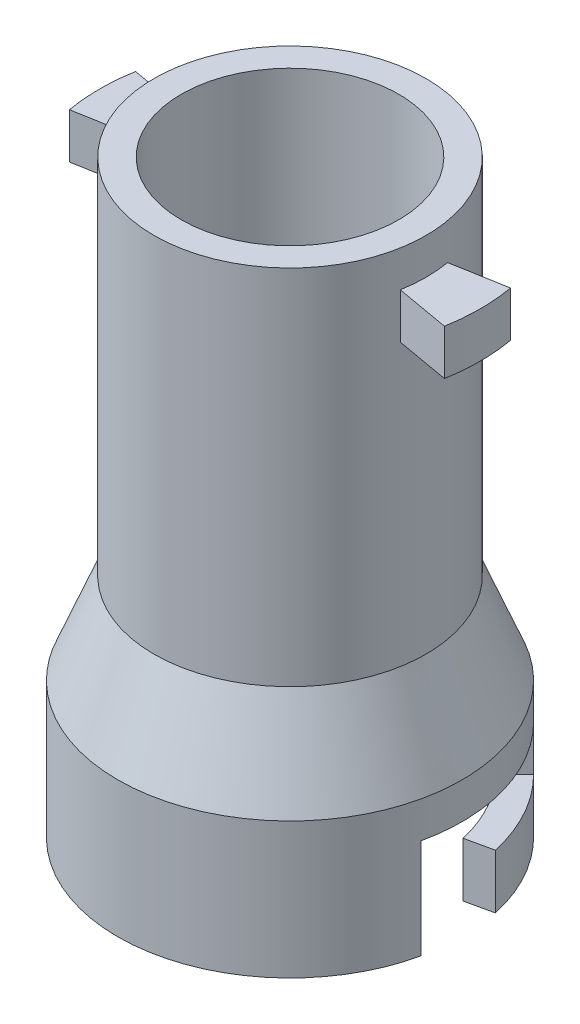
ISO-10303-21;
HEADER;
FILE_DESCRIPTION(('STEP AP214'),'2;1');
FILE_NAME('part.step','',(''),(''),'','','');
FILE_SCHEMA(('AUTOMOTIVE_DESIGN { 1 0 10303 214 1 1 1 1 }'));
ENDSEC;
DATA;
#1=APPLICATION_CONTEXT('core data for automotive mechanical design processes');
#2=APPLICATION_PROTOCOL_DEFINITION('international standard','automotive_design',2000,#1);
#3=PRODUCT_CONTEXT('',#1,'mechanical');
#4=PRODUCT('Part','Part','',(#3));
#5=PRODUCT_RELATED_PRODUCT_CATEGORY('part','',(#4));
#6=PRODUCT_DEFINITION_FORMATION('','',#4);
#7=PRODUCT_DEFINITION_CONTEXT('part definition',#1,'design');
#8=PRODUCT_DEFINITION('design','',#6,#7);
#9=PRODUCT_DEFINITION_SHAPE('','',#8);
#10=(LENGTH_UNIT() NAMED_UNIT(*) SI_UNIT(.MILLI.,.METRE.));
#11=(NAMED_UNIT(*) PLANE_ANGLE_UNIT() SI_UNIT($,.RADIAN.));
#12=(NAMED_UNIT(*) SI_UNIT($,.STERADIAN.) SOLID_ANGLE_UNIT());
#13=UNCERTAINTY_MEASURE_WITH_UNIT(LENGTH_MEASURE(1.E-05),#10,'distance_accuracy_value','');
#14=(GEOMETRIC_REPRESENTATION_CONTEXT(3) GLOBAL_UNCERTAINTY_ASSIGNED_CONTEXT((#13)) GLOBAL_UNIT_ASSIGNED_CONTEXT((#10,
#11,#12)) REPRESENTATION_CONTEXT('',''));
#15=CARTESIAN_POINT('',(0.,0.,0.));
#16=DIRECTION('',(0.,0.,1.));
#17=DIRECTION('',(1.,0.,0.));
#18=AXIS2_PLACEMENT_3D('',#15,#16,#17);
#19=CARTESIAN_POINT('',(0.,40.467735012162,0.));
#20=DIRECTION('',(0.,1.,0.));
#21=DIRECTION('',(0.,0.,1.));
#22=AXIS2_PLACEMENT_3D('',#19,#20,#21);
#23=CYLINDRICAL_SURFACE('',#22,16.);
#24=CARTESIAN_POINT('',(0.,-18.,0.));
#25=DIRECTION('',(0.,1.,0.));
#26=DIRECTION('',(0.,0.,1.));
#27=AXIS2_PLACEMENT_3D('',#24,#25,#26);
#28=CIRCLE('',#27,16.);
#29=CARTESIAN_POINT('',(0.,-18.,16.));
#30=VERTEX_POINT('',#29);
#31=EDGE_CURVE('E338',#30,#30,#28,.T.);
#32=ORIENTED_EDGE('',*,*,#31,.T.);
#33=EDGE_LOOP('',(#32));
#34=FACE_BOUND('',#33,.T.);
#35=DIRECTION('',(0.,1.,0.));
#36=VECTOR('',#35,1.);
#37=CARTESIAN_POINT('',(-11.3137084989848,-27.,11.3137084989848));
#38=LINE('',#37,#36);
#39=CARTESIAN_POINT('',(-11.3137084989848,-27.,11.3137084989848));
#40=VERTEX_POINT('',#39);
#41=CARTESIAN_POINT('',(-11.3137084989848,-23.,11.3137084989848));
#42=VERTEX_POINT('',#41);
#43=EDGE_CURVE('E190',#40,#42,#38,.T.);
#44=ORIENTED_EDGE('',*,*,#43,.T.);
#45=CARTESIAN_POINT('',(0.,-23.,0.));
#46=DIRECTION('',(0.,1.,0.));
#47=DIRECTION('',(0.,0.,1.));
#48=AXIS2_PLACEMENT_3D('',#45,#46,#47);
#49=CIRCLE('',#48,16.);
#50=CARTESIAN_POINT('',(-15.6207361139189,-23.,-3.46303382300966));
#51=VERTEX_POINT('',#50);
#52=EDGE_CURVE('E174',#51,#42,#49,.T.);
#53=ORIENTED_EDGE('',*,*,#52,.F.);
#54=DIRECTION('',(0.,1.,0.));
#55=VECTOR('',#54,1.);
#56=CARTESIAN_POINT('',(-15.6207361139189,-23.,-3.46303382300966));
#57=LINE('',#56,#55);
#58=CARTESIAN_POINT('',(-15.6207361139189,-33.,-3.46303382300966));
#59=VERTEX_POINT('',#58);
#60=EDGE_CURVE('E253',#59,#51,#57,.T.);
#61=ORIENTED_EDGE('',*,*,#60,.F.);
#62=CARTESIAN_POINT('',(0.,-33.,0.));
#63=DIRECTION('',(0.,1.,0.));
#64=DIRECTION('',(0.,0.,1.));
#65=AXIS2_PLACEMENT_3D('',#62,#63,#64);
#66=CIRCLE('',#65,16.);
#67=CARTESIAN_POINT('',(15.6207361139189,-33.,-3.46303382300966));
#68=VERTEX_POINT('',#67);
#69=EDGE_CURVE('E334',#68,#59,#66,.T.);
#70=ORIENTED_EDGE('',*,*,#69,.F.);
#71=DIRECTION('',(0.,-1.,0.));
#72=VECTOR('',#71,1.);
#73=CARTESIAN_POINT('',(15.6207361139189,-33.,-3.46303382300966));
#74=LINE('',#73,#72);
#75=CARTESIAN_POINT('',(15.6207361139189,-27.,-3.46303382300966));
#76=VERTEX_POINT('',#75);
#77=EDGE_CURVE('E222',#76,#68,#74,.T.);
#78=ORIENTED_EDGE('',*,*,#77,.F.);
#79=CARTESIAN_POINT('',(0.,-27.,0.));
#80=DIRECTION('',(0.,-1.,0.));
#81=DIRECTION('',(0.,0.,-1.));
#82=AXIS2_PLACEMENT_3D('',#79,#80,#81);
#83=CIRCLE('',#82,16.);
#84=CARTESIAN_POINT('',(11.3137084989848,-27.,-11.3137084989848));
#85=VERTEX_POINT('',#84);
#86=EDGE_CURVE('E215',#85,#76,#83,.T.);
#87=ORIENTED_EDGE('',*,*,#86,.F.);
#88=DIRECTION('',(0.,-1.,0.));
#89=VECTOR('',#88,1.);
#90=CARTESIAN_POINT('',(11.3137084989848,-22.,-11.3137084989848));
#91=LINE('',#90,#89);
#92=CARTESIAN_POINT('',(11.3137084989848,-22.,-11.3137084989848));
#93=VERTEX_POINT('',#92);
#94=EDGE_CURVE('E210',#93,#85,#91,.T.);
#95=ORIENTED_EDGE('',*,*,#94,.F.);
#96=CARTESIAN_POINT('',(0.,-22.,0.));
#97=DIRECTION('',(0.,1.,0.));
#98=DIRECTION('',(0.,0.,1.));
#99=AXIS2_PLACEMENT_3D('',#96,#97,#98);
#100=CIRCLE('',#99,16.);
#101=CARTESIAN_POINT('',(15.6207361139189,-22.,3.46303382300966));
#102=VERTEX_POINT('',#101);
#103=EDGE_CURVE('E236',#102,#93,#100,.T.);
#104=ORIENTED_EDGE('',*,*,#103,.F.);
#105=DIRECTION('',(0.,-1.,0.));
#106=VECTOR('',#105,1.);
#107=CARTESIAN_POINT('',(15.6207361139189,-33.,3.46303382300966));
#108=LINE('',#107,#106);
#109=CARTESIAN_POINT('',(15.6207361139189,-33.,3.46303382300966));
#110=VERTEX_POINT('',#109);
#111=EDGE_CURVE('E230',#102,#110,#108,.T.);
#112=ORIENTED_EDGE('',*,*,#111,.T.);
#113=CARTESIAN_POINT('',(-15.6207361139189,-33.,3.46303382300966));
#114=VERTEX_POINT('',#113);
#115=EDGE_CURVE('E335',#114,#110,#66,.T.);
#116=ORIENTED_EDGE('',*,*,#115,.F.);
#117=DIRECTION('',(0.,1.,0.));
#118=VECTOR('',#117,1.);
#119=CARTESIAN_POINT('',(-15.6207361139189,-23.,3.46303382300966));
#120=LINE('',#119,#118);
#121=CARTESIAN_POINT('',(-15.6207361139189,-27.,3.46303382300966));
#122=VERTEX_POINT('',#121);
#123=EDGE_CURVE('E245',#114,#122,#120,.T.);
#124=ORIENTED_EDGE('',*,*,#123,.T.);
#125=CARTESIAN_POINT('',(0.,-27.,0.));
#126=DIRECTION('',(0.,-1.,0.));
#127=DIRECTION('',(0.,0.,-1.));
#128=AXIS2_PLACEMENT_3D('',#125,#126,#127);
#129=CIRCLE('',#128,16.);
#130=EDGE_CURVE('E49',#40,#122,#129,.T.);
#131=ORIENTED_EDGE('',*,*,#130,.F.);
#132=EDGE_LOOP('',(#44,#53,#61,#70,#78,#87,#95,#104,#112,#116,#124,#131));
#133=FACE_BOUND('',#132,.T.);
#134=ADVANCED_FACE('F35',(#34,#133),#23,.F.);
#135=CARTESIAN_POINT('',(0.,40.467735012162,0.));
#136=DIRECTION('',(0.,1.,0.));
#137=DIRECTION('',(0.,0.,1.));
#138=AXIS2_PLACEMENT_3D('',#135,#136,#137);
#139=CYLINDRICAL_SURFACE('',#138,19.);
#140=CARTESIAN_POINT('',(0.,-18.,0.));
#141=DIRECTION('',(0.,1.,0.));
#142=DIRECTION('',(0.,0.,1.));
#143=AXIS2_PLACEMENT_3D('',#140,#141,#142);
#144=CIRCLE('',#143,19.);
#145=CARTESIAN_POINT('',(0.,-18.,19.));
#146=VERTEX_POINT('',#145);
#147=EDGE_CURVE('E327',#146,#146,#144,.T.);
#148=ORIENTED_EDGE('',*,*,#147,.F.);
#149=EDGE_LOOP('',(#148));
#150=FACE_BOUND('',#149,.T.);
#151=CARTESIAN_POINT('',(0.,-23.,0.));
#152=DIRECTION('',(0.,1.,0.));
#153=DIRECTION('',(0.,0.,1.));
#154=AXIS2_PLACEMENT_3D('',#151,#152,#153);
#155=CIRCLE('',#154,19.);
#156=CARTESIAN_POINT('',(-18.5496241352787,-23.,-4.11235266482396));
#157=VERTEX_POINT('',#156);
#158=CARTESIAN_POINT('',(-13.4350288425444,-23.,13.4350288425444));
#159=VERTEX_POINT('',#158);
#160=EDGE_CURVE('E185',#157,#159,#155,.T.);
#161=ORIENTED_EDGE('',*,*,#160,.T.);
#162=DIRECTION('',(0.,-1.,0.));
#163=VECTOR('',#162,1.);
#164=CARTESIAN_POINT('',(-13.4350288425444,-27.,13.4350288425444));
#165=LINE('',#164,#163);
#166=CARTESIAN_POINT('',(-13.4350288425444,-27.,13.4350288425444));
#167=VERTEX_POINT('',#166);
#168=EDGE_CURVE('E192',#159,#167,#165,.T.);
#169=ORIENTED_EDGE('',*,*,#168,.T.);
#170=CARTESIAN_POINT('',(0.,-27.,0.));
#171=DIRECTION('',(0.,-1.,0.));
#172=DIRECTION('',(0.,0.,-1.));
#173=AXIS2_PLACEMENT_3D('',#170,#171,#172);
#174=CIRCLE('',#173,19.);
#175=CARTESIAN_POINT('',(-18.5496241352787,-27.,4.11235266482397));
#176=VERTEX_POINT('',#175);
#177=EDGE_CURVE('E201',#167,#176,#174,.T.);
#178=ORIENTED_EDGE('',*,*,#177,.T.);
#179=DIRECTION('',(0.,-1.,0.));
#180=VECTOR('',#179,1.);
#181=CARTESIAN_POINT('',(-18.5496241352787,-23.,4.11235266482396));
#182=LINE('',#181,#180);
#183=CARTESIAN_POINT('',(-18.5496241352787,-33.,4.11235266482397));
#184=VERTEX_POINT('',#183);
#185=EDGE_CURVE('E240',#176,#184,#182,.T.);
#186=ORIENTED_EDGE('',*,*,#185,.T.);
#187=CARTESIAN_POINT('',(0.,-33.,0.));
#188=DIRECTION('',(0.,1.,0.));
#189=DIRECTION('',(0.,0.,1.));
#190=AXIS2_PLACEMENT_3D('',#187,#188,#189);
#191=CIRCLE('',#190,19.);
#192=CARTESIAN_POINT('',(18.5496241352787,-33.,4.11235266482396));
#193=VERTEX_POINT('',#192);
#194=EDGE_CURVE('E331',#184,#193,#191,.T.);
#195=ORIENTED_EDGE('',*,*,#194,.T.);
#196=DIRECTION('',(0.,1.,0.));
#197=VECTOR('',#196,1.);
#198=CARTESIAN_POINT('',(18.5496241352787,-33.,4.11235266482396));
#199=LINE('',#198,#197);
#200=CARTESIAN_POINT('',(18.5496241352787,-22.,4.11235266482396));
#201=VERTEX_POINT('',#200);
#202=EDGE_CURVE('E225',#193,#201,#199,.T.);
#203=ORIENTED_EDGE('',*,*,#202,.T.);
#204=CARTESIAN_POINT('',(0.,-22.,0.));
#205=DIRECTION('',(0.,1.,0.));
#206=DIRECTION('',(0.,0.,1.));
#207=AXIS2_PLACEMENT_3D('',#204,#205,#206);
#208=CIRCLE('',#207,19.);
#209=CARTESIAN_POINT('',(13.4350288425444,-22.,-13.4350288425444));
#210=VERTEX_POINT('',#209);
#211=EDGE_CURVE('E238',#201,#210,#208,.T.);
#212=ORIENTED_EDGE('',*,*,#211,.T.);
#213=DIRECTION('',(0.,1.,0.));
#214=VECTOR('',#213,1.);
#215=CARTESIAN_POINT('',(13.4350288425444,-22.,-13.4350288425444));
#216=LINE('',#215,#214);
#217=CARTESIAN_POINT('',(13.4350288425444,-27.,-13.4350288425444));
#218=VERTEX_POINT('',#217);
#219=EDGE_CURVE('E204',#218,#210,#216,.T.);
#220=ORIENTED_EDGE('',*,*,#219,.F.);
#221=CARTESIAN_POINT('',(0.,-27.,0.));
#222=DIRECTION('',(0.,-1.,0.));
#223=DIRECTION('',(0.,0.,-1.));
#224=AXIS2_PLACEMENT_3D('',#221,#222,#223);
#225=CIRCLE('',#224,19.);
#226=CARTESIAN_POINT('',(18.5496241352787,-27.,-4.11235266482397));
#227=VERTEX_POINT('',#226);
#228=EDGE_CURVE('E217',#218,#227,#225,.T.);
#229=ORIENTED_EDGE('',*,*,#228,.T.);
#230=DIRECTION('',(0.,1.,0.));
#231=VECTOR('',#230,1.);
#232=CARTESIAN_POINT('',(18.5496241352787,-33.,-4.11235266482397));
#233=LINE('',#232,#231);
#234=CARTESIAN_POINT('',(18.5496241352787,-33.,-4.11235266482397));
#235=VERTEX_POINT('',#234);
#236=EDGE_CURVE('E220',#235,#227,#233,.T.);
#237=ORIENTED_EDGE('',*,*,#236,.F.);
#238=CARTESIAN_POINT('',(-18.5496241352787,-33.,-4.11235266482396));
#239=VERTEX_POINT('',#238);
#240=EDGE_CURVE('E330',#235,#239,#191,.T.);
#241=ORIENTED_EDGE('',*,*,#240,.T.);
#242=DIRECTION('',(0.,-1.,0.));
#243=VECTOR('',#242,1.);
#244=CARTESIAN_POINT('',(-18.5496241352787,-23.,-4.11235266482396));
#245=LINE('',#244,#243);
#246=EDGE_CURVE('E247',#157,#239,#245,.T.);
#247=ORIENTED_EDGE('',*,*,#246,.F.);
#248=EDGE_LOOP('',(#161,#169,#178,#186,#195,#203,#212,#220,#229,#237,#241,#247));
#249=FACE_BOUND('',#248,.T.);
#250=ADVANCED_FACE('F354',(#150,#249),#139,.T.);
#251=CARTESIAN_POINT('',(-18.5496241352787,-33.,4.11235266482397));
#252=DIRECTION('',(0.216439613938103,0.,0.976296007119933));
#253=DIRECTION('',(0.976296007119933,0.,-0.216439613938103));
#254=AXIS2_PLACEMENT_3D('',#251,#252,#253);
#255=PLANE('',#254);
#256=DIRECTION('',(-0.976296007119933,0.,0.216439613938103));
#257=VECTOR('',#256,1.);
#258=CARTESIAN_POINT('',(-18.5496241352787,-27.,4.11235266482397));
#259=LINE('',#258,#257);
#260=EDGE_CURVE('E11',#122,#176,#259,.T.);
#261=ORIENTED_EDGE('',*,*,#260,.F.);
#262=ORIENTED_EDGE('',*,*,#123,.F.);
#263=DIRECTION('',(0.976296007119933,0.,-0.216439613938103));
#264=VECTOR('',#263,1.);
#265=CARTESIAN_POINT('',(-18.5496241352787,-33.,4.11235266482397));
#266=LINE('',#265,#264);
#267=EDGE_CURVE('E242',#184,#114,#266,.T.);
#268=ORIENTED_EDGE('',*,*,#267,.F.);
#269=ORIENTED_EDGE('',*,*,#185,.F.);
#270=EDGE_LOOP('',(#261,#262,#268,#269));
#271=FACE_BOUND('',#270,.T.);
#272=ADVANCED_FACE('F375',(#271),#255,.F.);
#273=CARTESIAN_POINT('',(16.,-33.,0.));
#274=DIRECTION('',(0.,1.,0.));
#275=DIRECTION('',(0.,0.,1.));
#276=AXIS2_PLACEMENT_3D('',#273,#274,#275);
#277=PLANE('',#276);
#278=DIRECTION('',(0.976296007119933,0.,-0.216439613938103));
#279=VECTOR('',#278,1.);
#280=CARTESIAN_POINT('',(18.5496241352787,-33.,-4.11235266482397));
#281=LINE('',#280,#279);
#282=EDGE_CURVE('E57',#68,#235,#281,.T.);
#283=ORIENTED_EDGE('',*,*,#282,.F.);
#284=ORIENTED_EDGE('',*,*,#69,.T.);
#285=DIRECTION('',(0.976296007119933,0.,0.216439613938103));
#286=VECTOR('',#285,1.);
#287=CARTESIAN_POINT('',(-18.5496241352787,-33.,-4.11235266482396));
#288=LINE('',#287,#286);
#289=EDGE_CURVE('E250',#239,#59,#288,.T.);
#290=ORIENTED_EDGE('',*,*,#289,.F.);
#291=ORIENTED_EDGE('',*,*,#240,.F.);
#292=EDGE_LOOP('',(#283,#284,#290,#291));
#293=FACE_BOUND('',#292,.T.);
#294=ADVANCED_FACE('F529',(#293),#277,.F.);
#295=ORIENTED_EDGE('',*,*,#115,.T.);
#296=DIRECTION('',(0.976296007119933,0.,0.216439613938103));
#297=VECTOR('',#296,1.);
#298=CARTESIAN_POINT('',(18.5496241352787,-33.,4.11235266482396));
#299=LINE('',#298,#297);
#300=EDGE_CURVE('E233',#110,#193,#299,.T.);
#301=ORIENTED_EDGE('',*,*,#300,.T.);
#302=ORIENTED_EDGE('',*,*,#194,.F.);
#303=ORIENTED_EDGE('',*,*,#267,.T.);
#304=EDGE_LOOP('',(#295,#301,#302,#303));
#305=FACE_BOUND('',#304,.T.);
#306=ADVANCED_FACE('F380',(#305),#277,.F.);
#307=CARTESIAN_POINT('',(0.,40.467735012162,0.));
#308=DIRECTION('',(0.,1.,0.));
#309=DIRECTION('',(0.,0.,1.));
#310=AXIS2_PLACEMENT_3D('',#307,#308,#309);
#311=CYLINDRICAL_SURFACE('',#310,15.);
#312=CARTESIAN_POINT('',(0.,23.,0.));
#313=DIRECTION('',(0.,1.,0.));
#314=DIRECTION('',(0.,0.,1.));
#315=AXIS2_PLACEMENT_3D('',#312,#313,#314);
#316=CIRCLE('',#315,15.);
#317=CARTESIAN_POINT('',(-14.7721162951831,23.,-2.60472266500396));
#318=VERTEX_POINT('',#317);
#319=CARTESIAN_POINT('',(-14.7721162951831,23.,2.60472266500396));
#320=VERTEX_POINT('',#319);
#321=EDGE_CURVE('E283',#318,#320,#316,.T.);
#322=ORIENTED_EDGE('',*,*,#321,.F.);
#323=DIRECTION('',(0.,1.,0.));
#324=VECTOR('',#323,1.);
#325=CARTESIAN_POINT('',(-14.7721162951831,28.,-2.60472266500396));
#326=LINE('',#325,#324);
#327=CARTESIAN_POINT('',(-14.7721162951831,28.,-2.60472266500396));
#328=VERTEX_POINT('',#327);
#329=EDGE_CURVE('E277',#318,#328,#326,.T.);
#330=ORIENTED_EDGE('',*,*,#329,.T.);
#331=CARTESIAN_POINT('',(0.,28.,0.));
#332=DIRECTION('',(0.,1.,0.));
#333=DIRECTION('',(0.,0.,1.));
#334=AXIS2_PLACEMENT_3D('',#331,#332,#333);
#335=CIRCLE('',#334,15.);
#336=CARTESIAN_POINT('',(-14.7721162951831,28.,2.60472266500396));
#337=VERTEX_POINT('',#336);
#338=EDGE_CURVE('E286',#328,#337,#335,.T.);
#339=ORIENTED_EDGE('',*,*,#338,.T.);
#340=DIRECTION('',(0.,1.,0.));
#341=VECTOR('',#340,1.);
#342=CARTESIAN_POINT('',(-14.7721162951831,28.,2.60472266500396));
#343=LINE('',#342,#341);
#344=EDGE_CURVE('E265',#320,#337,#343,.T.);
#345=ORIENTED_EDGE('',*,*,#344,.F.);
#346=EDGE_LOOP('',(#322,#330,#339,#345));
#347=FACE_BOUND('',#346,.T.);
#348=CARTESIAN_POINT('',(0.,-8.,0.));
#349=DIRECTION('',(0.,1.,0.));
#350=DIRECTION('',(0.,0.,1.));
#351=AXIS2_PLACEMENT_3D('',#348,#349,#350);
#352=CIRCLE('',#351,15.);
#353=CARTESIAN_POINT('',(0.,-8.,15.));
#354=VERTEX_POINT('',#353);
#355=EDGE_CURVE('E324',#354,#354,#352,.T.);
#356=ORIENTED_EDGE('',*,*,#355,.T.);
#357=EDGE_LOOP('',(#356));
#358=FACE_BOUND('',#357,.T.);
#359=CARTESIAN_POINT('',(0.,32.,0.));
#360=DIRECTION('',(0.,1.,0.));
#361=DIRECTION('',(0.,0.,1.));
#362=AXIS2_PLACEMENT_3D('',#359,#360,#361);
#363=CIRCLE('',#362,15.);
#364=CARTESIAN_POINT('',(0.,32.,15.));
#365=VERTEX_POINT('',#364);
#366=EDGE_CURVE('E321',#365,#365,#363,.T.);
#367=ORIENTED_EDGE('',*,*,#366,.F.);
#368=EDGE_LOOP('',(#367));
#369=FACE_BOUND('',#368,.T.);
#370=DIRECTION('',(0.,-1.,0.));
#371=VECTOR('',#370,1.);
#372=CARTESIAN_POINT('',(14.7721162951831,23.,2.60472266500396));
#373=LINE('',#372,#371);
#374=CARTESIAN_POINT('',(14.7721162951831,28.,2.60472266500396));
#375=VERTEX_POINT('',#374);
#376=CARTESIAN_POINT('',(14.7721162951831,23.,2.60472266500396));
#377=VERTEX_POINT('',#376);
#378=EDGE_CURVE('E299',#375,#377,#373,.T.);
#379=ORIENTED_EDGE('',*,*,#378,.F.);
#380=CARTESIAN_POINT('',(0.,28.,0.));
#381=DIRECTION('',(0.,1.,0.));
#382=DIRECTION('',(0.,0.,1.));
#383=AXIS2_PLACEMENT_3D('',#380,#381,#382);
#384=CIRCLE('',#383,15.);
#385=CARTESIAN_POINT('',(14.7721162951831,28.,-2.60472266500396));
#386=VERTEX_POINT('',#385);
#387=EDGE_CURVE('E318',#375,#386,#384,.T.);
#388=ORIENTED_EDGE('',*,*,#387,.T.);
#389=DIRECTION('',(0.,-1.,0.));
#390=VECTOR('',#389,1.);
#391=CARTESIAN_POINT('',(14.7721162951831,23.,-2.60472266500396));
#392=LINE('',#391,#390);
#393=CARTESIAN_POINT('',(14.7721162951831,23.,-2.60472266500396));
#394=VERTEX_POINT('',#393);
#395=EDGE_CURVE('E288',#386,#394,#392,.T.);
#396=ORIENTED_EDGE('',*,*,#395,.T.);
#397=CARTESIAN_POINT('',(0.,23.,0.));
#398=DIRECTION('',(0.,1.,0.));
#399=DIRECTION('',(0.,0.,1.));
#400=AXIS2_PLACEMENT_3D('',#397,#398,#399);
#401=CIRCLE('',#400,15.);
#402=EDGE_CURVE('E311',#377,#394,#401,.T.);
#403=ORIENTED_EDGE('',*,*,#402,.F.);
#404=EDGE_LOOP('',(#379,#388,#396,#403));
#405=FACE_BOUND('',#404,.T.);
#406=ADVANCED_FACE('F391',(#347,#358,#369,#405),#311,.T.);
#407=CARTESIAN_POINT('',(15.,32.,0.));
#408=DIRECTION('',(0.,-1.,0.));
#409=DIRECTION('',(0.,0.,-1.));
#410=AXIS2_PLACEMENT_3D('',#407,#408,#409);
#411=PLANE('',#410);
#412=CARTESIAN_POINT('',(0.,32.,0.));
#413=DIRECTION('',(0.,1.,0.));
#414=DIRECTION('',(0.,0.,1.));
#415=AXIS2_PLACEMENT_3D('',#412,#413,#414);
#416=CIRCLE('',#415,12.);
#417=CARTESIAN_POINT('',(0.,32.,12.));
#418=VERTEX_POINT('',#417);
#419=EDGE_CURVE('E344',#418,#418,#416,.T.);
#420=ORIENTED_EDGE('',*,*,#419,.F.);
#421=EDGE_LOOP('',(#420));
#422=FACE_BOUND('',#421,.T.);
#423=ORIENTED_EDGE('',*,*,#366,.T.);
#424=EDGE_LOOP('',(#423));
#425=FACE_BOUND('',#424,.T.);
#426=ADVANCED_FACE('F37',(#422,#425),#411,.F.);
#427=CARTESIAN_POINT('',(0.,40.467735012162,0.));
#428=DIRECTION('',(0.,1.,0.));
#429=DIRECTION('',(0.,0.,1.));
#430=AXIS2_PLACEMENT_3D('',#427,#428,#429);
#431=CYLINDRICAL_SURFACE('',#430,12.);
#432=CARTESIAN_POINT('',(0.,-18.,0.));
#433=DIRECTION('',(0.,1.,0.));
#434=DIRECTION('',(0.,0.,1.));
#435=AXIS2_PLACEMENT_3D('',#432,#433,#434);
#436=CIRCLE('',#435,12.);
#437=CARTESIAN_POINT('',(0.,-18.,12.));
#438=VERTEX_POINT('',#437);
#439=EDGE_CURVE('E341',#438,#438,#436,.T.);
#440=ORIENTED_EDGE('',*,*,#439,.F.);
#441=EDGE_LOOP('',(#440));
#442=FACE_BOUND('',#441,.T.);
#443=ORIENTED_EDGE('',*,*,#419,.T.);
#444=EDGE_LOOP('',(#443));
#445=FACE_BOUND('',#444,.T.);
#446=ADVANCED_FACE('F384',(#442,#445),#431,.F.);
#447=CARTESIAN_POINT('',(12.,-18.,0.));
#448=DIRECTION('',(0.,1.,0.));
#449=DIRECTION('',(0.,0.,1.));
#450=AXIS2_PLACEMENT_3D('',#447,#448,#449);
#451=PLANE('',#450);
#452=ORIENTED_EDGE('',*,*,#31,.F.);
#453=EDGE_LOOP('',(#452));
#454=FACE_BOUND('',#453,.T.);
#455=ORIENTED_EDGE('',*,*,#439,.T.);
#456=EDGE_LOOP('',(#455));
#457=FACE_BOUND('',#456,.T.);
#458=ADVANCED_FACE('F381',(#454,#457),#451,.F.);
#459=CARTESIAN_POINT('',(0.,-18.,0.));
#460=DIRECTION('',(0.,-1.,0.));
#461=DIRECTION('',(0.,0.,-1.));
#462=AXIS2_PLACEMENT_3D('',#459,#460,#461);
#463=CONICAL_SURFACE('',#462,19.,0.380506377112366);
#464=ORIENTED_EDGE('',*,*,#355,.F.);
#465=EDGE_LOOP('',(#464));
#466=FACE_BOUND('',#465,.T.);
#467=ORIENTED_EDGE('',*,*,#147,.T.);
#468=EDGE_LOOP('',(#467));
#469=FACE_BOUND('',#468,.T.);
#470=ADVANCED_FACE('F383',(#466,#469),#463,.T.);
#471=CARTESIAN_POINT('',(14.7721162951831,28.,2.60472266500396));
#472=DIRECTION('',(0.,-1.,0.));
#473=DIRECTION('',(0.,0.,-1.));
#474=AXIS2_PLACEMENT_3D('',#471,#472,#473);
#475=PLANE('',#474);
#476=CARTESIAN_POINT('',(0.,28.,0.));
#477=DIRECTION('',(0.,1.,0.));
#478=DIRECTION('',(0.,0.,1.));
#479=AXIS2_PLACEMENT_3D('',#476,#477,#478);
#480=CIRCLE('',#479,21.);
#481=CARTESIAN_POINT('',(20.6809628132564,28.,3.64661173100555));
#482=VERTEX_POINT('',#481);
#483=CARTESIAN_POINT('',(20.6809628132564,28.,-3.64661173100555));
#484=VERTEX_POINT('',#483);
#485=EDGE_CURVE('E316',#482,#484,#480,.T.);
#486=ORIENTED_EDGE('',*,*,#485,.T.);
#487=DIRECTION('',(-0.984807753012208,0.,0.173648177666931));
#488=VECTOR('',#487,1.);
#489=CARTESIAN_POINT('',(14.7721162951831,28.,-2.60472266500396));
#490=LINE('',#489,#488);
#491=EDGE_CURVE('E297',#484,#386,#490,.T.);
#492=ORIENTED_EDGE('',*,*,#491,.T.);
#493=ORIENTED_EDGE('',*,*,#387,.F.);
#494=DIRECTION('',(-0.984807753012208,0.,-0.173648177666931));
#495=VECTOR('',#494,1.);
#496=CARTESIAN_POINT('',(14.7721162951831,28.,2.60472266500396));
#497=LINE('',#496,#495);
#498=EDGE_CURVE('E308',#482,#375,#497,.T.);
#499=ORIENTED_EDGE('',*,*,#498,.F.);
#500=EDGE_LOOP('',(#486,#492,#493,#499));
#501=FACE_BOUND('',#500,.T.);
#502=ADVANCED_FACE('F410',(#501),#475,.F.);
#503=CARTESIAN_POINT('',(0.,45.3066617431812,0.));
#504=DIRECTION('',(0.,1.,0.));
#505=DIRECTION('',(0.,0.,1.));
#506=AXIS2_PLACEMENT_3D('',#503,#504,#505);
#507=CYLINDRICAL_SURFACE('',#506,21.);
#508=CARTESIAN_POINT('',(0.,23.,0.));
#509=DIRECTION('',(0.,1.,0.));
#510=DIRECTION('',(0.,0.,1.));
#511=AXIS2_PLACEMENT_3D('',#508,#509,#510);
#512=CIRCLE('',#511,21.);
#513=CARTESIAN_POINT('',(20.6809628132564,23.,3.64661173100555));
#514=VERTEX_POINT('',#513);
#515=CARTESIAN_POINT('',(20.6809628132564,23.,-3.64661173100555));
#516=VERTEX_POINT('',#515);
#517=EDGE_CURVE('E314',#514,#516,#512,.T.);
#518=ORIENTED_EDGE('',*,*,#517,.T.);
#519=DIRECTION('',(0.,1.,0.));
#520=VECTOR('',#519,1.);
#521=CARTESIAN_POINT('',(20.6809628132564,28.,-3.64661173100555));
#522=LINE('',#521,#520);
#523=EDGE_CURVE('E294',#516,#484,#522,.T.);
#524=ORIENTED_EDGE('',*,*,#523,.T.);
#525=ORIENTED_EDGE('',*,*,#485,.F.);
#526=DIRECTION('',(0.,1.,0.));
#527=VECTOR('',#526,1.);
#528=CARTESIAN_POINT('',(20.6809628132564,28.,3.64661173100555));
#529=LINE('',#528,#527);
#530=EDGE_CURVE('E305',#514,#482,#529,.T.);
#531=ORIENTED_EDGE('',*,*,#530,.F.);
#532=EDGE_LOOP('',(#518,#524,#525,#531));
#533=FACE_BOUND('',#532,.T.);
#534=ADVANCED_FACE('F419',(#533),#507,.T.);
#535=CARTESIAN_POINT('',(20.6809628132564,23.,3.64661173100555));
#536=DIRECTION('',(0.,1.,0.));
#537=DIRECTION('',(0.,0.,1.));
#538=AXIS2_PLACEMENT_3D('',#535,#536,#537);
#539=PLANE('',#538);
#540=DIRECTION('',(0.984807753012208,0.,0.173648177666931));
#541=VECTOR('',#540,1.);
#542=CARTESIAN_POINT('',(20.6809628132564,23.,3.64661173100555));
#543=LINE('',#542,#541);
#544=EDGE_CURVE('E302',#377,#514,#543,.T.);
#545=ORIENTED_EDGE('',*,*,#544,.F.);
#546=ORIENTED_EDGE('',*,*,#402,.T.);
#547=DIRECTION('',(0.984807753012208,0.,-0.173648177666931));
#548=VECTOR('',#547,1.);
#549=CARTESIAN_POINT('',(20.6809628132564,23.,-3.64661173100555));
#550=LINE('',#549,#548);
#551=EDGE_CURVE('E291',#394,#516,#550,.T.);
#552=ORIENTED_EDGE('',*,*,#551,.T.);
#553=ORIENTED_EDGE('',*,*,#517,.F.);
#554=EDGE_LOOP('',(#545,#546,#552,#553));
#555=FACE_BOUND('',#554,.T.);
#556=ADVANCED_FACE('F417',(#555),#539,.F.);
#557=CARTESIAN_POINT('',(14.7721162951831,28.,2.60472266500396));
#558=DIRECTION('',(0.173648177666931,0.,-0.984807753012208));
#559=DIRECTION('',(-0.984807753012208,0.,-0.173648177666931));
#560=AXIS2_PLACEMENT_3D('',#557,#558,#559);
#561=PLANE('',#560);
#562=ORIENTED_EDGE('',*,*,#378,.T.);
#563=ORIENTED_EDGE('',*,*,#544,.T.);
#564=ORIENTED_EDGE('',*,*,#530,.T.);
#565=ORIENTED_EDGE('',*,*,#498,.T.);
#566=EDGE_LOOP('',(#562,#563,#564,#565));
#567=FACE_BOUND('',#566,.T.);
#568=ADVANCED_FACE('F406',(#567),#561,.F.);
#569=CARTESIAN_POINT('',(14.7721162951831,28.,-2.60472266500396));
#570=DIRECTION('',(-0.173648177666931,0.,-0.984807753012208));
#571=DIRECTION('',(-0.984807753012208,0.,0.173648177666931));
#572=AXIS2_PLACEMENT_3D('',#569,#570,#571);
#573=PLANE('',#572);
#574=ORIENTED_EDGE('',*,*,#395,.F.);
#575=ORIENTED_EDGE('',*,*,#491,.F.);
#576=ORIENTED_EDGE('',*,*,#523,.F.);
#577=ORIENTED_EDGE('',*,*,#551,.F.);
#578=EDGE_LOOP('',(#574,#575,#576,#577));
#579=FACE_BOUND('',#578,.T.);
#580=ADVANCED_FACE('F415',(#579),#573,.T.);
#581=CARTESIAN_POINT('',(-20.6809628132564,28.,-3.64661173100555));
#582=DIRECTION('',(0.,1.,0.));
#583=DIRECTION('',(0.,0.,1.));
#584=AXIS2_PLACEMENT_3D('',#581,#582,#583);
#585=PLANE('',#584);
#586=ORIENTED_EDGE('',*,*,#338,.F.);
#587=DIRECTION('',(-0.984807753012208,0.,-0.173648177666931));
#588=VECTOR('',#587,1.);
#589=CARTESIAN_POINT('',(-20.6809628132564,28.,-3.64661173100555));
#590=LINE('',#589,#588);
#591=CARTESIAN_POINT('',(-20.6809628132564,28.,-3.64661173100555));
#592=VERTEX_POINT('',#591);
#593=EDGE_CURVE('E268',#328,#592,#590,.T.);
#594=ORIENTED_EDGE('',*,*,#593,.T.);
#595=CARTESIAN_POINT('',(0.,28.,0.));
#596=DIRECTION('',(0.,1.,0.));
#597=DIRECTION('',(0.,0.,1.));
#598=AXIS2_PLACEMENT_3D('',#595,#596,#597);
#599=CIRCLE('',#598,21.);
#600=CARTESIAN_POINT('',(-20.6809628132564,28.,3.64661173100555));
#601=VERTEX_POINT('',#600);
#602=EDGE_CURVE('E279',#592,#601,#599,.T.);
#603=ORIENTED_EDGE('',*,*,#602,.T.);
#604=DIRECTION('',(-0.984807753012208,0.,0.173648177666931));
#605=VECTOR('',#604,1.);
#606=CARTESIAN_POINT('',(-20.6809628132564,28.,3.64661173100555));
#607=LINE('',#606,#605);
#608=EDGE_CURVE('E184',#337,#601,#607,.T.);
#609=ORIENTED_EDGE('',*,*,#608,.F.);
#610=EDGE_LOOP('',(#586,#594,#603,#609));
#611=FACE_BOUND('',#610,.T.);
#612=ADVANCED_FACE('F473',(#611),#585,.T.);
#613=CARTESIAN_POINT('',(-14.7721162951831,23.,-2.60472266500396));
#614=DIRECTION('',(0.,-1.,0.));
#615=DIRECTION('',(0.,0.,-1.));
#616=AXIS2_PLACEMENT_3D('',#613,#614,#615);
#617=PLANE('',#616);
#618=CARTESIAN_POINT('',(0.,23.,0.));
#619=DIRECTION('',(0.,1.,0.));
#620=DIRECTION('',(0.,0.,1.));
#621=AXIS2_PLACEMENT_3D('',#618,#619,#620);
#622=CIRCLE('',#621,21.);
#623=CARTESIAN_POINT('',(-20.6809628132564,23.,-3.64661173100555));
#624=VERTEX_POINT('',#623);
#625=CARTESIAN_POINT('',(-20.6809628132564,23.,3.64661173100555));
#626=VERTEX_POINT('',#625);
#627=EDGE_CURVE('E281',#624,#626,#622,.T.);
#628=ORIENTED_EDGE('',*,*,#627,.F.);
#629=DIRECTION('',(0.984807753012208,0.,0.173648177666931));
#630=VECTOR('',#629,1.);
#631=CARTESIAN_POINT('',(-14.7721162951831,23.,-2.60472266500396));
#632=LINE('',#631,#630);
#633=EDGE_CURVE('E274',#624,#318,#632,.T.);
#634=ORIENTED_EDGE('',*,*,#633,.T.);
#635=ORIENTED_EDGE('',*,*,#321,.T.);
#636=DIRECTION('',(0.984807753012208,0.,-0.173648177666931));
#637=VECTOR('',#636,1.);
#638=CARTESIAN_POINT('',(-14.7721162951831,23.,2.60472266500396));
#639=LINE('',#638,#637);
#640=EDGE_CURVE('E262',#626,#320,#639,.T.);
#641=ORIENTED_EDGE('',*,*,#640,.F.);
#642=EDGE_LOOP('',(#628,#634,#635,#641));
#643=FACE_BOUND('',#642,.T.);
#644=ADVANCED_FACE('F482',(#643),#617,.T.);
#645=CARTESIAN_POINT('',(0.,45.3066617431812,0.));
#646=DIRECTION('',(0.,1.,0.));
#647=DIRECTION('',(0.,0.,1.));
#648=AXIS2_PLACEMENT_3D('',#645,#646,#647);
#649=CYLINDRICAL_SURFACE('',#648,21.);
#650=DIRECTION('',(0.,-1.,0.));
#651=VECTOR('',#650,1.);
#652=CARTESIAN_POINT('',(-20.6809628132564,23.,-3.64661173100555));
#653=LINE('',#652,#651);
#654=EDGE_CURVE('E271',#592,#624,#653,.T.);
#655=ORIENTED_EDGE('',*,*,#654,.T.);
#656=ORIENTED_EDGE('',*,*,#627,.T.);
#657=DIRECTION('',(0.,-1.,0.));
#658=VECTOR('',#657,1.);
#659=CARTESIAN_POINT('',(-20.6809628132564,23.,3.64661173100555));
#660=LINE('',#659,#658);
#661=EDGE_CURVE('E259',#601,#626,#660,.T.);
#662=ORIENTED_EDGE('',*,*,#661,.F.);
#663=ORIENTED_EDGE('',*,*,#602,.F.);
#664=EDGE_LOOP('',(#655,#656,#662,#663));
#665=FACE_BOUND('',#664,.T.);
#666=ADVANCED_FACE('F492',(#665),#649,.T.);
#667=CARTESIAN_POINT('',(-14.7721162951831,28.,-2.60472266500396));
#668=DIRECTION('',(0.173648177666931,0.,-0.984807753012208));
#669=DIRECTION('',(-0.984807753012208,0.,-0.173648177666931));
#670=AXIS2_PLACEMENT_3D('',#667,#668,#669);
#671=PLANE('',#670);
#672=ORIENTED_EDGE('',*,*,#593,.F.);
#673=ORIENTED_EDGE('',*,*,#329,.F.);
#674=ORIENTED_EDGE('',*,*,#633,.F.);
#675=ORIENTED_EDGE('',*,*,#654,.F.);
#676=EDGE_LOOP('',(#672,#673,#674,#675));
#677=FACE_BOUND('',#676,.T.);
#678=ADVANCED_FACE('F502',(#677),#671,.T.);
#679=CARTESIAN_POINT('',(-14.7721162951831,28.,2.60472266500396));
#680=DIRECTION('',(-0.173648177666931,0.,-0.984807753012208));
#681=DIRECTION('',(-0.984807753012208,0.,0.173648177666931));
#682=AXIS2_PLACEMENT_3D('',#679,#680,#681);
#683=PLANE('',#682);
#684=ORIENTED_EDGE('',*,*,#608,.T.);
#685=ORIENTED_EDGE('',*,*,#661,.T.);
#686=ORIENTED_EDGE('',*,*,#640,.T.);
#687=ORIENTED_EDGE('',*,*,#344,.T.);
#688=EDGE_LOOP('',(#684,#685,#686,#687));
#689=FACE_BOUND('',#688,.T.);
#690=ADVANCED_FACE('F512',(#689),#683,.F.);
#691=CARTESIAN_POINT('',(-18.5496241352787,-23.,-4.11235266482396));
#692=DIRECTION('',(0.,1.,0.));
#693=DIRECTION('',(0.,0.,1.));
#694=AXIS2_PLACEMENT_3D('',#691,#692,#693);
#695=PLANE('',#694);
#696=DIRECTION('',(-0.707106781186546,0.,0.707106781186549));
#697=VECTOR('',#696,1.);
#698=CARTESIAN_POINT('',(-11.3137084989848,-23.,11.3137084989848));
#699=LINE('',#698,#697);
#700=EDGE_CURVE('E177',#42,#159,#699,.T.);
#701=ORIENTED_EDGE('',*,*,#700,.T.);
#702=ORIENTED_EDGE('',*,*,#160,.F.);
#703=DIRECTION('',(-0.976296007119933,0.,-0.216439613938103));
#704=VECTOR('',#703,1.);
#705=CARTESIAN_POINT('',(-18.5496241352787,-23.,-4.11235266482396));
#706=LINE('',#705,#704);
#707=EDGE_CURVE('E180',#51,#157,#706,.T.);
#708=ORIENTED_EDGE('',*,*,#707,.F.);
#709=ORIENTED_EDGE('',*,*,#52,.T.);
#710=EDGE_LOOP('',(#701,#702,#708,#709));
#711=FACE_BOUND('',#710,.T.);
#712=ADVANCED_FACE('F176',(#711),#695,.F.);
#713=CARTESIAN_POINT('',(-18.5496241352787,-33.,-4.11235266482396));
#714=DIRECTION('',(-0.216439613938103,0.,0.976296007119933));
#715=DIRECTION('',(0.976296007119933,0.,0.216439613938103));
#716=AXIS2_PLACEMENT_3D('',#713,#714,#715);
#717=PLANE('',#716);
#718=ORIENTED_EDGE('',*,*,#246,.T.);
#719=ORIENTED_EDGE('',*,*,#289,.T.);
#720=ORIENTED_EDGE('',*,*,#60,.T.);
#721=ORIENTED_EDGE('',*,*,#707,.T.);
#722=EDGE_LOOP('',(#718,#719,#720,#721));
#723=FACE_BOUND('',#722,.T.);
#724=ADVANCED_FACE('F547',(#723),#717,.T.);
#725=CARTESIAN_POINT('',(18.5496241352787,-22.,4.11235266482396));
#726=DIRECTION('',(0.,-1.,0.));
#727=DIRECTION('',(0.,0.,-1.));
#728=AXIS2_PLACEMENT_3D('',#725,#726,#727);
#729=PLANE('',#728);
#730=DIRECTION('',(-0.707106781186546,0.,0.707106781186549));
#731=VECTOR('',#730,1.);
#732=CARTESIAN_POINT('',(13.4350288425444,-22.,-13.4350288425444));
#733=LINE('',#732,#731);
#734=EDGE_CURVE('E207',#210,#93,#733,.T.);
#735=ORIENTED_EDGE('',*,*,#734,.F.);
#736=ORIENTED_EDGE('',*,*,#211,.F.);
#737=DIRECTION('',(-0.976296007119933,0.,-0.216439613938103));
#738=VECTOR('',#737,1.);
#739=CARTESIAN_POINT('',(18.5496241352787,-22.,4.11235266482396));
#740=LINE('',#739,#738);
#741=EDGE_CURVE('E228',#201,#102,#740,.T.);
#742=ORIENTED_EDGE('',*,*,#741,.T.);
#743=ORIENTED_EDGE('',*,*,#103,.T.);
#744=EDGE_LOOP('',(#735,#736,#742,#743));
#745=FACE_BOUND('',#744,.T.);
#746=ADVANCED_FACE('F366',(#745),#729,.T.);
#747=CARTESIAN_POINT('',(18.5496241352787,-22.,4.11235266482396));
#748=DIRECTION('',(-0.216439613938103,0.,0.976296007119933));
#749=DIRECTION('',(0.976296007119933,0.,0.216439613938103));
#750=AXIS2_PLACEMENT_3D('',#747,#748,#749);
#751=PLANE('',#750);
#752=ORIENTED_EDGE('',*,*,#202,.F.);
#753=ORIENTED_EDGE('',*,*,#300,.F.);
#754=ORIENTED_EDGE('',*,*,#111,.F.);
#755=ORIENTED_EDGE('',*,*,#741,.F.);
#756=EDGE_LOOP('',(#752,#753,#754,#755));
#757=FACE_BOUND('',#756,.T.);
#758=ADVANCED_FACE('F358',(#757),#751,.F.);
#759=CARTESIAN_POINT('',(18.5496241352787,-22.,-4.11235266482397));
#760=DIRECTION('',(0.216439613938103,0.,0.976296007119933));
#761=DIRECTION('',(0.976296007119933,0.,-0.216439613938103));
#762=AXIS2_PLACEMENT_3D('',#759,#760,#761);
#763=PLANE('',#762);
#764=DIRECTION('',(0.976296007119933,0.,-0.216439613938103));
#765=VECTOR('',#764,1.);
#766=CARTESIAN_POINT('',(18.5496241352787,-27.,-4.11235266482397));
#767=LINE('',#766,#765);
#768=EDGE_CURVE('E43',#76,#227,#767,.T.);
#769=ORIENTED_EDGE('',*,*,#768,.F.);
#770=ORIENTED_EDGE('',*,*,#77,.T.);
#771=ORIENTED_EDGE('',*,*,#282,.T.);
#772=ORIENTED_EDGE('',*,*,#236,.T.);
#773=EDGE_LOOP('',(#769,#770,#771,#772));
#774=FACE_BOUND('',#773,.T.);
#775=ADVANCED_FACE('F356',(#774),#763,.T.);
#776=CARTESIAN_POINT('',(13.4350288425444,-27.,-13.4350288425444));
#777=DIRECTION('',(0.,-1.,0.));
#778=DIRECTION('',(0.,0.,-1.));
#779=AXIS2_PLACEMENT_3D('',#776,#777,#778);
#780=PLANE('',#779);
#781=ORIENTED_EDGE('',*,*,#768,.T.);
#782=ORIENTED_EDGE('',*,*,#228,.F.);
#783=DIRECTION('',(0.707106781186546,0.,-0.707106781186549));
#784=VECTOR('',#783,1.);
#785=CARTESIAN_POINT('',(13.4350288425444,-27.,-13.4350288425444));
#786=LINE('',#785,#784);
#787=EDGE_CURVE('E212',#85,#218,#786,.T.);
#788=ORIENTED_EDGE('',*,*,#787,.F.);
#789=ORIENTED_EDGE('',*,*,#86,.T.);
#790=EDGE_LOOP('',(#781,#782,#788,#789));
#791=FACE_BOUND('',#790,.T.);
#792=ADVANCED_FACE('F348',(#791),#780,.F.);
#793=CARTESIAN_POINT('',(13.4350288425444,-27.,-13.4350288425444));
#794=DIRECTION('',(-0.707106781186549,0.,-0.707106781186546));
#795=DIRECTION('',(-0.707106781186546,0.,0.707106781186549));
#796=AXIS2_PLACEMENT_3D('',#793,#794,#795);
#797=PLANE('',#796);
#798=ORIENTED_EDGE('',*,*,#219,.T.);
#799=ORIENTED_EDGE('',*,*,#734,.T.);
#800=ORIENTED_EDGE('',*,*,#94,.T.);
#801=ORIENTED_EDGE('',*,*,#787,.T.);
#802=EDGE_LOOP('',(#798,#799,#800,#801));
#803=FACE_BOUND('',#802,.T.);
#804=ADVANCED_FACE('F364',(#803),#797,.F.);
#805=CARTESIAN_POINT('',(-11.3137084989848,-27.,11.3137084989848));
#806=DIRECTION('',(0.,1.,0.));
#807=DIRECTION('',(0.,0.,1.));
#808=AXIS2_PLACEMENT_3D('',#805,#806,#807);
#809=PLANE('',#808);
#810=ORIENTED_EDGE('',*,*,#260,.T.);
#811=ORIENTED_EDGE('',*,*,#177,.F.);
#812=DIRECTION('',(0.707106781186546,0.,-0.707106781186549));
#813=VECTOR('',#812,1.);
#814=CARTESIAN_POINT('',(-11.3137084989848,-27.,11.3137084989848));
#815=LINE('',#814,#813);
#816=EDGE_CURVE('E198',#167,#40,#815,.T.);
#817=ORIENTED_EDGE('',*,*,#816,.T.);
#818=ORIENTED_EDGE('',*,*,#130,.T.);
#819=EDGE_LOOP('',(#810,#811,#817,#818));
#820=FACE_BOUND('',#819,.T.);
#821=ADVANCED_FACE('F612',(#820),#809,.T.);
#822=CARTESIAN_POINT('',(-11.3137084989848,-23.,11.3137084989848));
#823=DIRECTION('',(0.707106781186549,0.,0.707106781186546));
#824=DIRECTION('',(0.707106781186546,0.,-0.707106781186549));
#825=AXIS2_PLACEMENT_3D('',#822,#823,#824);
#826=PLANE('',#825);
#827=ORIENTED_EDGE('',*,*,#43,.F.);
#828=ORIENTED_EDGE('',*,*,#816,.F.);
#829=ORIENTED_EDGE('',*,*,#168,.F.);
#830=ORIENTED_EDGE('',*,*,#700,.F.);
#831=EDGE_LOOP('',(#827,#828,#829,#830));
#832=FACE_BOUND('',#831,.T.);
#833=ADVANCED_FACE('F188',(#832),#826,.F.);
#834=CLOSED_SHELL('',(#134,#250,#272,#294,#306,#406,#426,#446,#458,#470,#502,#534,#556,#568,
#580,#612,#644,#666,#678,#690,#712,#724,#746,#758,#775,#792,#804,#821,#833));
#835=MANIFOLD_SOLID_BREP('B2',#834);
#836=ADVANCED_BREP_SHAPE_REPRESENTATION('',(#18,#835),#14);
#837=SHAPE_DEFINITION_REPRESENTATION(#9,#836);
ENDSEC;
END-ISO-10303-21;
